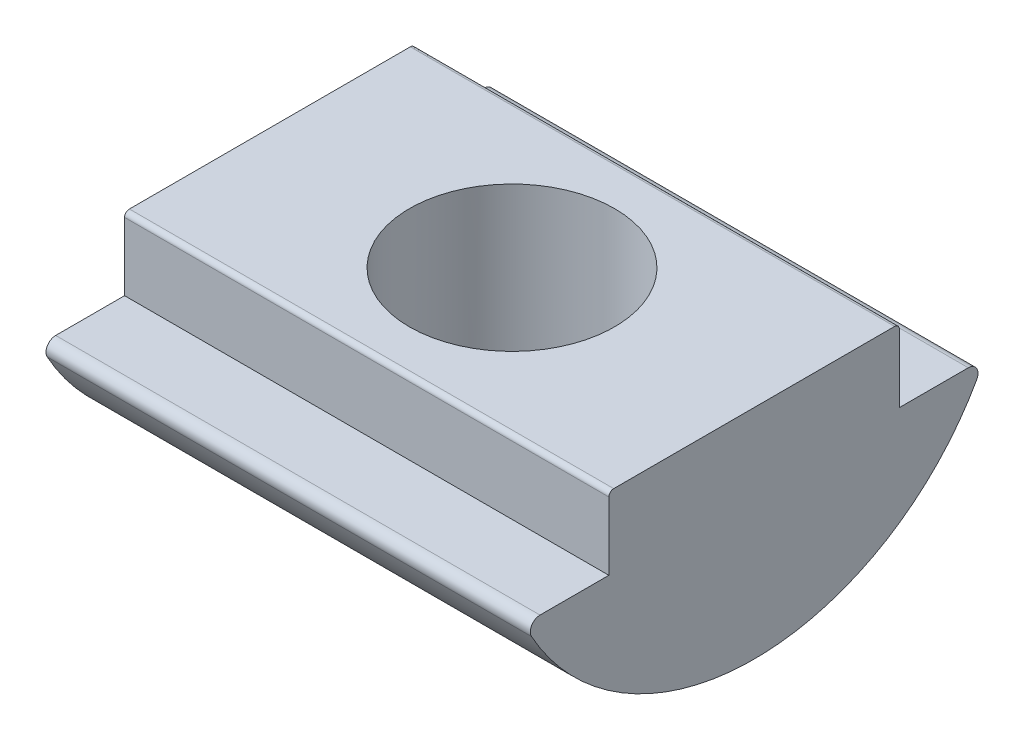
ISO-10303-21;
HEADER;
FILE_DESCRIPTION(('STEP AP214'),'2;1');
FILE_NAME('part.step','',(''),(''),'','','');
FILE_SCHEMA(('AUTOMOTIVE_DESIGN { 1 0 10303 214 1 1 1 1 }'));
ENDSEC;
DATA;
#1=APPLICATION_CONTEXT('core data for automotive mechanical design processes');
#2=APPLICATION_PROTOCOL_DEFINITION('international standard','automotive_design',2000,#1);
#3=PRODUCT_CONTEXT('',#1,'mechanical');
#4=PRODUCT('Part','Part','',(#3));
#5=PRODUCT_RELATED_PRODUCT_CATEGORY('part','',(#4));
#6=PRODUCT_DEFINITION_FORMATION('','',#4);
#7=PRODUCT_DEFINITION_CONTEXT('part definition',#1,'design');
#8=PRODUCT_DEFINITION('design','',#6,#7);
#9=PRODUCT_DEFINITION_SHAPE('','',#8);
#10=(LENGTH_UNIT() NAMED_UNIT(*) SI_UNIT(.MILLI.,.METRE.));
#11=(NAMED_UNIT(*) PLANE_ANGLE_UNIT() SI_UNIT($,.RADIAN.));
#12=(NAMED_UNIT(*) SI_UNIT($,.STERADIAN.) SOLID_ANGLE_UNIT());
#13=UNCERTAINTY_MEASURE_WITH_UNIT(LENGTH_MEASURE(1.E-05),#10,'distance_accuracy_value','');
#14=(GEOMETRIC_REPRESENTATION_CONTEXT(3) GLOBAL_UNCERTAINTY_ASSIGNED_CONTEXT((#13)) GLOBAL_UNIT_ASSIGNED_CONTEXT((#10,
#11,#12)) REPRESENTATION_CONTEXT('',''));
#15=CARTESIAN_POINT('',(0.,0.,0.));
#16=DIRECTION('',(0.,0.,1.));
#17=DIRECTION('',(1.,0.,0.));
#18=AXIS2_PLACEMENT_3D('',#15,#16,#17);
#19=CARTESIAN_POINT('',(5.,-2.25,0.));
#20=DIRECTION('',(1.,0.,0.));
#21=DIRECTION('',(0.,1.,0.));
#22=AXIS2_PLACEMENT_3D('',#19,#20,#21);
#23=PLANE('',#22);
#24=DIRECTION('',(0.,0.,1.));
#25=VECTOR('',#24,1.);
#26=CARTESIAN_POINT('',(5.,0.,0.));
#27=LINE('',#26,#25);
#28=CARTESIAN_POINT('',(5.,0.,-2.9));
#29=VERTEX_POINT('',#28);
#30=CARTESIAN_POINT('',(5.,0.,2.9));
#31=VERTEX_POINT('',#30);
#32=EDGE_CURVE('E11',#29,#31,#27,.T.);
#33=ORIENTED_EDGE('',*,*,#32,.T.);
#34=CARTESIAN_POINT('',(5.,-0.1,2.9));
#35=DIRECTION('',(1.,0.,0.));
#36=DIRECTION('',(0.,1.,0.));
#37=AXIS2_PLACEMENT_3D('',#34,#35,#36);
#38=CIRCLE('',#37,0.1);
#39=CARTESIAN_POINT('',(5.,-0.1,3.));
#40=VERTEX_POINT('',#39);
#41=EDGE_CURVE('E207',#31,#40,#38,.T.);
#42=ORIENTED_EDGE('',*,*,#41,.T.);
#43=DIRECTION('',(0.,-1.,0.));
#44=VECTOR('',#43,1.);
#45=CARTESIAN_POINT('',(5.,-0.1,3.));
#46=LINE('',#45,#44);
#47=CARTESIAN_POINT('',(5.,-1.5,3.));
#48=VERTEX_POINT('',#47);
#49=EDGE_CURVE('E178',#40,#48,#46,.T.);
#50=ORIENTED_EDGE('',*,*,#49,.T.);
#51=DIRECTION('',(0.,0.,1.));
#52=VECTOR('',#51,1.);
#53=CARTESIAN_POINT('',(5.,-1.5,3.));
#54=LINE('',#53,#52);
#55=CARTESIAN_POINT('',(5.,-1.5,4.4220093471935));
#56=VERTEX_POINT('',#55);
#57=EDGE_CURVE('E204',#48,#56,#54,.T.);
#58=ORIENTED_EDGE('',*,*,#57,.T.);
#59=CARTESIAN_POINT('',(5.,-1.7,4.4220093471935));
#60=DIRECTION('',(1.,0.,0.));
#61=DIRECTION('',(0.,1.,0.));
#62=AXIS2_PLACEMENT_3D('',#59,#60,#61);
#63=CIRCLE('',#62,0.2);
#64=CARTESIAN_POINT('',(5.,-1.7972416632359,4.59677793399078));
#65=VERTEX_POINT('',#64);
#66=EDGE_CURVE('E142',#56,#65,#63,.T.);
#67=ORIENTED_EDGE('',*,*,#66,.T.);
#68=CARTESIAN_POINT('',(5.,0.760416666666591,0.));
#69=DIRECTION('',(1.,0.,0.));
#70=DIRECTION('',(0.,-0.486208316179486,0.873842933986371));
#71=AXIS2_PLACEMENT_3D('',#68,#69,#70);
#72=CIRCLE('',#71,5.26041666666664);
#73=CARTESIAN_POINT('',(5.,-1.7972416632359,-4.59677793399078));
#74=VERTEX_POINT('',#73);
#75=EDGE_CURVE('E137',#65,#74,#72,.T.);
#76=ORIENTED_EDGE('',*,*,#75,.T.);
#77=CARTESIAN_POINT('',(5.,-1.7,-4.4220093471935));
#78=DIRECTION('',(1.,0.,0.));
#79=DIRECTION('',(0.,-0.486208316179487,-0.873842933986371));
#80=AXIS2_PLACEMENT_3D('',#77,#78,#79);
#81=CIRCLE('',#80,0.2);
#82=CARTESIAN_POINT('',(5.,-1.5,-4.4220093471935));
#83=VERTEX_POINT('',#82);
#84=EDGE_CURVE('E140',#74,#83,#81,.T.);
#85=ORIENTED_EDGE('',*,*,#84,.T.);
#86=DIRECTION('',(0.,0.,1.));
#87=VECTOR('',#86,1.);
#88=CARTESIAN_POINT('',(5.,-1.5,-3.));
#89=LINE('',#88,#87);
#90=CARTESIAN_POINT('',(5.,-1.5,-3.));
#91=VERTEX_POINT('',#90);
#92=EDGE_CURVE('E75',#83,#91,#89,.T.);
#93=ORIENTED_EDGE('',*,*,#92,.T.);
#94=DIRECTION('',(0.,1.,0.));
#95=VECTOR('',#94,1.);
#96=CARTESIAN_POINT('',(5.,-0.1,-3.));
#97=LINE('',#96,#95);
#98=CARTESIAN_POINT('',(5.,-0.1,-3.));
#99=VERTEX_POINT('',#98);
#100=EDGE_CURVE('E83',#91,#99,#97,.T.);
#101=ORIENTED_EDGE('',*,*,#100,.T.);
#102=CARTESIAN_POINT('',(5.,-0.1,-2.9));
#103=DIRECTION('',(1.,0.,0.));
#104=DIRECTION('',(0.,0.,-1.));
#105=AXIS2_PLACEMENT_3D('',#102,#103,#104);
#106=CIRCLE('',#105,0.1);
#107=EDGE_CURVE('E189',#99,#29,#106,.T.);
#108=ORIENTED_EDGE('',*,*,#107,.T.);
#109=EDGE_LOOP('',(#33,#42,#50,#58,#67,#76,#85,#93,#101,#108));
#110=FACE_BOUND('',#109,.T.);
#111=ADVANCED_FACE('F17',(#110),#23,.T.);
#112=CARTESIAN_POINT('',(0.,0.,-2.9));
#113=DIRECTION('',(0.,1.,0.));
#114=DIRECTION('',(1.,0.,0.));
#115=AXIS2_PLACEMENT_3D('',#112,#113,#114);
#116=PLANE('',#115);
#117=CARTESIAN_POINT('',(0.,0.,0.));
#118=DIRECTION('',(0.,-1.,0.));
#119=DIRECTION('',(0.,0.,1.));
#120=AXIS2_PLACEMENT_3D('',#117,#118,#119);
#121=CIRCLE('',#120,2.117);
#122=CARTESIAN_POINT('',(0.,0.,2.117));
#123=VERTEX_POINT('',#122);
#124=CARTESIAN_POINT('',(0.,0.,-2.117));
#125=VERTEX_POINT('',#124);
#126=EDGE_CURVE('E198',#123,#125,#121,.T.);
#127=ORIENTED_EDGE('',*,*,#126,.T.);
#128=CARTESIAN_POINT('',(0.,0.,0.));
#129=DIRECTION('',(0.,-1.,0.));
#130=DIRECTION('',(0.,0.,1.));
#131=AXIS2_PLACEMENT_3D('',#128,#129,#130);
#132=CIRCLE('',#131,2.117);
#133=EDGE_CURVE('E193',#125,#123,#132,.T.);
#134=ORIENTED_EDGE('',*,*,#133,.T.);
#135=EDGE_LOOP('',(#127,#134));
#136=FACE_BOUND('',#135,.T.);
#137=DIRECTION('',(1.,0.,0.));
#138=VECTOR('',#137,1.);
#139=CARTESIAN_POINT('',(0.,0.,2.9));
#140=LINE('',#139,#138);
#141=CARTESIAN_POINT('',(-5.,0.,2.9));
#142=VERTEX_POINT('',#141);
#143=EDGE_CURVE('E29',#142,#31,#140,.T.);
#144=ORIENTED_EDGE('',*,*,#143,.T.);
#145=ORIENTED_EDGE('',*,*,#32,.F.);
#146=DIRECTION('',(1.,0.,0.));
#147=VECTOR('',#146,1.);
#148=CARTESIAN_POINT('',(0.,0.,-2.9));
#149=LINE('',#148,#147);
#150=CARTESIAN_POINT('',(-5.,0.,-2.9));
#151=VERTEX_POINT('',#150);
#152=EDGE_CURVE('E174',#151,#29,#149,.T.);
#153=ORIENTED_EDGE('',*,*,#152,.F.);
#154=DIRECTION('',(0.,0.,-1.));
#155=VECTOR('',#154,1.);
#156=CARTESIAN_POINT('',(-5.,0.,0.));
#157=LINE('',#156,#155);
#158=EDGE_CURVE('E213',#142,#151,#157,.T.);
#159=ORIENTED_EDGE('',*,*,#158,.F.);
#160=EDGE_LOOP('',(#144,#145,#153,#159));
#161=FACE_BOUND('',#160,.T.);
#162=ADVANCED_FACE('F280',(#136,#161),#116,.T.);
#163=CARTESIAN_POINT('',(0.,-0.1,2.9));
#164=DIRECTION('',(1.,0.,0.));
#165=DIRECTION('',(0.,1.,0.));
#166=AXIS2_PLACEMENT_3D('',#163,#164,#165);
#167=CYLINDRICAL_SURFACE('',#166,0.1);
#168=DIRECTION('',(1.,0.,0.));
#169=VECTOR('',#168,1.);
#170=CARTESIAN_POINT('',(0.,-0.1,3.));
#171=LINE('',#170,#169);
#172=CARTESIAN_POINT('',(-5.,-0.1,3.));
#173=VERTEX_POINT('',#172);
#174=EDGE_CURVE('E181',#173,#40,#171,.T.);
#175=ORIENTED_EDGE('',*,*,#174,.T.);
#176=ORIENTED_EDGE('',*,*,#41,.F.);
#177=ORIENTED_EDGE('',*,*,#143,.F.);
#178=CARTESIAN_POINT('',(-5.,-0.1,2.9));
#179=DIRECTION('',(-1.,0.,0.));
#180=DIRECTION('',(0.,1.,0.));
#181=AXIS2_PLACEMENT_3D('',#178,#179,#180);
#182=CIRCLE('',#181,0.1);
#183=EDGE_CURVE('E170',#173,#142,#182,.T.);
#184=ORIENTED_EDGE('',*,*,#183,.F.);
#185=EDGE_LOOP('',(#175,#176,#177,#184));
#186=FACE_BOUND('',#185,.T.);
#187=ADVANCED_FACE('F276',(#186),#167,.T.);
#188=CARTESIAN_POINT('',(0.,-0.1,3.));
#189=DIRECTION('',(0.,0.,1.));
#190=DIRECTION('',(1.,0.,0.));
#191=AXIS2_PLACEMENT_3D('',#188,#189,#190);
#192=PLANE('',#191);
#193=DIRECTION('',(1.,0.,0.));
#194=VECTOR('',#193,1.);
#195=CARTESIAN_POINT('',(0.,-1.5,3.));
#196=LINE('',#195,#194);
#197=CARTESIAN_POINT('',(-5.,-1.5,3.));
#198=VERTEX_POINT('',#197);
#199=EDGE_CURVE('E182',#198,#48,#196,.T.);
#200=ORIENTED_EDGE('',*,*,#199,.T.);
#201=ORIENTED_EDGE('',*,*,#49,.F.);
#202=ORIENTED_EDGE('',*,*,#174,.F.);
#203=DIRECTION('',(0.,1.,0.));
#204=VECTOR('',#203,1.);
#205=CARTESIAN_POINT('',(-5.,-0.1,3.));
#206=LINE('',#205,#204);
#207=EDGE_CURVE('E175',#198,#173,#206,.T.);
#208=ORIENTED_EDGE('',*,*,#207,.F.);
#209=EDGE_LOOP('',(#200,#201,#202,#208));
#210=FACE_BOUND('',#209,.T.);
#211=ADVANCED_FACE('F279',(#210),#192,.T.);
#212=CARTESIAN_POINT('',(0.,-1.5,3.));
#213=DIRECTION('',(0.,1.,0.));
#214=DIRECTION('',(1.,0.,0.));
#215=AXIS2_PLACEMENT_3D('',#212,#213,#214);
#216=PLANE('',#215);
#217=DIRECTION('',(1.,0.,0.));
#218=VECTOR('',#217,1.);
#219=CARTESIAN_POINT('',(0.,-1.5,4.4220093471935));
#220=LINE('',#219,#218);
#221=CARTESIAN_POINT('',(-5.,-1.5,4.4220093471935));
#222=VERTEX_POINT('',#221);
#223=EDGE_CURVE('E169',#222,#56,#220,.T.);
#224=ORIENTED_EDGE('',*,*,#223,.T.);
#225=ORIENTED_EDGE('',*,*,#57,.F.);
#226=ORIENTED_EDGE('',*,*,#199,.F.);
#227=DIRECTION('',(0.,0.,-1.));
#228=VECTOR('',#227,1.);
#229=CARTESIAN_POINT('',(-5.,-1.5,3.));
#230=LINE('',#229,#228);
#231=EDGE_CURVE('E222',#222,#198,#230,.T.);
#232=ORIENTED_EDGE('',*,*,#231,.F.);
#233=EDGE_LOOP('',(#224,#225,#226,#232));
#234=FACE_BOUND('',#233,.T.);
#235=ADVANCED_FACE('F294',(#234),#216,.T.);
#236=CARTESIAN_POINT('',(0.,-1.7,4.4220093471935));
#237=DIRECTION('',(1.,0.,0.));
#238=DIRECTION('',(0.,1.,0.));
#239=AXIS2_PLACEMENT_3D('',#236,#237,#238);
#240=CYLINDRICAL_SURFACE('',#239,0.2);
#241=DIRECTION('',(1.,0.,0.));
#242=VECTOR('',#241,1.);
#243=CARTESIAN_POINT('',(0.,-1.7972416632359,4.59677793399078));
#244=LINE('',#243,#242);
#245=CARTESIAN_POINT('',(-5.,-1.7972416632359,4.59677793399078));
#246=VERTEX_POINT('',#245);
#247=EDGE_CURVE('E147',#246,#65,#244,.T.);
#248=ORIENTED_EDGE('',*,*,#247,.T.);
#249=ORIENTED_EDGE('',*,*,#66,.F.);
#250=ORIENTED_EDGE('',*,*,#223,.F.);
#251=CARTESIAN_POINT('',(-5.,-1.7,4.4220093471935));
#252=DIRECTION('',(-1.,0.,0.));
#253=DIRECTION('',(0.,1.,0.));
#254=AXIS2_PLACEMENT_3D('',#251,#252,#253);
#255=CIRCLE('',#254,0.2);
#256=EDGE_CURVE('E235',#246,#222,#255,.T.);
#257=ORIENTED_EDGE('',*,*,#256,.F.);
#258=EDGE_LOOP('',(#248,#249,#250,#257));
#259=FACE_BOUND('',#258,.T.);
#260=ADVANCED_FACE('F274',(#259),#240,.T.);
#261=CARTESIAN_POINT('',(0.,0.760416666666591,0.));
#262=DIRECTION('',(1.,0.,0.));
#263=DIRECTION('',(0.,-0.486208316179486,0.873842933986371));
#264=AXIS2_PLACEMENT_3D('',#261,#262,#263);
#265=CYLINDRICAL_SURFACE('',#264,5.26041666666664);
#266=CARTESIAN_POINT('',(0.,-4.05521356279914,-2.117));
#267=CARTESIAN_POINT('',(-0.0340343699446975,-4.05521503554478,-2.11699417105374));
#268=CARTESIAN_POINT('',(-0.0680661493535745,-4.05559493943595,-2.11613240673934));
#269=CARTESIAN_POINT('',(-0.136251357460678,-4.05709110713546,-2.11272540846669));
#270=CARTESIAN_POINT('',(-0.170404139391232,-4.05821214042359,-2.11016927021432));
#271=CARTESIAN_POINT('',(-0.238830745916795,-4.06118319527892,-2.10337142888061));
#272=CARTESIAN_POINT('',(-0.273102731949519,-4.06303991376115,-2.09911423808997));
#273=CARTESIAN_POINT('',(-0.341769070930095,-4.06746623480122,-2.08891396612756));
#274=CARTESIAN_POINT('',(-0.376159961841877,-4.07004412008693,-2.08295127800243));
#275=CARTESIAN_POINT('',(-0.44523398750845,-4.07590720402725,-2.06930213932706));
#276=CARTESIAN_POINT('',(-0.47990988819159,-4.07920513114918,-2.06158454891408));
#277=CARTESIAN_POINT('',(-0.548574640212661,-4.08643923966812,-2.04451867906343));
#278=CARTESIAN_POINT('',(-0.582566317678292,-4.09037158980233,-2.03518016414469));
#279=CARTESIAN_POINT('',(-0.649863205429612,-4.09884437207636,-2.01486634344044));
#280=CARTESIAN_POINT('',(-0.683170223051873,-4.10338287345614,-2.00389622266037));
#281=CARTESIAN_POINT('',(-0.749097987336444,-4.11303427718519,-1.98030847090098));
#282=CARTESIAN_POINT('',(-0.781718962766761,-4.11814698433462,-1.9676913995632));
#283=CARTESIAN_POINT('',(-0.845911861004093,-4.1288423855273,-1.94096229273271));
#284=CARTESIAN_POINT('',(-0.877490569837734,-4.13442045152168,-1.92686468498714));
#285=CARTESIAN_POINT('',(-0.940100475933886,-4.1460638135159,-1.89702173870008));
#286=CARTESIAN_POINT('',(-0.971124877226846,-4.15213279721164,-1.88126359498619));
#287=CARTESIAN_POINT('',(-1.03262772326348,-4.16471121704358,-1.84808466815149));
#288=CARTESIAN_POINT('',(-1.063096603711,-4.17122471469327,-1.83064771305409));
#289=CARTESIAN_POINT('',(-1.12349101201326,-4.18463967056115,-1.79409727968334));
#290=CARTESIAN_POINT('',(-1.15340411760189,-4.19154510548743,-1.77496476274342));
#291=CARTESIAN_POINT('',(-1.2111600744579,-4.2053212253162,-1.73604192482757));
#292=CARTESIAN_POINT('',(-1.23903860616296,-4.21218385412131,-1.71630164810154));
#293=CARTESIAN_POINT('',(-1.29363088630792,-4.22602343931657,-1.67566589928884));
#294=CARTESIAN_POINT('',(-1.32035082641295,-4.23299941289792,-1.65477841960859));
#295=CARTESIAN_POINT('',(-1.37262651092354,-4.24702395003211,-1.61184053242256));
#296=CARTESIAN_POINT('',(-1.39818662712273,-4.25407209211455,-1.58979531160397));
#297=CARTESIAN_POINT('',(-1.44814550688424,-4.26819679538087,-1.54453584705466));
#298=CARTESIAN_POINT('',(-1.47254648286257,-4.27527327196373,-1.52132401999946));
#299=CARTESIAN_POINT('',(-1.52007856031207,-4.28937716293457,-1.47383060057331));
#300=CARTESIAN_POINT('',(-1.54321471113664,-4.29640465698957,-1.44955408543545));
#301=CARTESIAN_POINT('',(-1.5883996236362,-4.31041083386255,-1.39977273622326));
#302=CARTESIAN_POINT('',(-1.61044260301433,-4.31738911782699,-1.37426254294275));
#303=CARTESIAN_POINT('',(-1.65344436156696,-4.33124449932843,-1.32200821592416));
#304=CARTESIAN_POINT('',(-1.67439457010825,-4.33812056072372,-1.29525675704466));
#305=CARTESIAN_POINT('',(-1.71521428221451,-4.35171666319676,-1.24051548428997));
#306=CARTESIAN_POINT('',(-1.73507243141759,-4.35843475635745,-1.2125167279679));
#307=CARTESIAN_POINT('',(-1.77408614997818,-4.37178869772126,-1.15471152341527));
#308=CARTESIAN_POINT('',(-1.79320165663903,-4.37841574655258,-1.12487597823876));
#309=CARTESIAN_POINT('',(-1.82977365811024,-4.39124683999114,-1.06455953413591));
#310=CARTESIAN_POINT('',(-1.84724552497469,-4.39745460902795,-1.03408876150079));
#311=CARTESIAN_POINT('',(-1.88053327847736,-4.40941745921277,-0.972509164576858));
#312=CARTESIAN_POINT('',(-1.89636185742594,-4.41517590872659,-0.941407862513951));
#313=CARTESIAN_POINT('',(-1.92636699045213,-4.42621040920348,-0.87857509511434));
#314=CARTESIAN_POINT('',(-1.94055311445353,-4.43148921156074,-0.846848687621283));
#315=CARTESIAN_POINT('',(-1.96737242616263,-4.4415727835144,-0.78252970415389));
#316=CARTESIAN_POINT('',(-1.97999961218141,-4.44637570785227,-0.749934334276129));
#317=CARTESIAN_POINT('',(-2.00363149118565,-4.4554460958251,-0.684009153934635));
#318=CARTESIAN_POINT('',(-2.01463272586211,-4.45971241534119,-0.650677946536393));
#319=CARTESIAN_POINT('',(-2.03501829780435,-4.4676720753344,-0.583290591663757));
#320=CARTESIAN_POINT('',(-2.0443950851575,-4.47136273280597,-0.549231844292767));
#321=CARTESIAN_POINT('',(-2.06153521374632,-4.47813314100162,-0.480399340879679));
#322=CARTESIAN_POINT('',(-2.06928697110425,-4.48120849898326,-0.445622272158392));
#323=CARTESIAN_POINT('',(-2.08296167011736,-4.48662280061713,-0.376478006516682));
#324=CARTESIAN_POINT('',(-2.08892210708077,-4.48897686631159,-0.342119406475736));
#325=CARTESIAN_POINT('',(-2.09912437920462,-4.49299807642356,-0.273471752429921));
#326=CARTESIAN_POINT('',(-2.10338336822664,-4.49467208023512,-0.239185661145842));
#327=CARTESIAN_POINT('',(-2.11018556860423,-4.49734049552133,-0.17069846612328));
#328=CARTESIAN_POINT('',(-2.112742434651,-4.49834031625463,-0.136498933890428));
#329=CARTESIAN_POINT('',(-2.11614453434899,-4.49966814639513,-0.0681992303094672));
#330=CARTESIAN_POINT('',(-2.11699956212584,-4.5000000000962,-0.0340996248006469));
#331=CARTESIAN_POINT('',(-2.11700043772085,-4.49999999990393,0.0340876858724113));
#332=CARTESIAN_POINT('',(-2.11614688385066,-4.49966837834658,0.0681753910231425));
#333=CARTESIAN_POINT('',(-2.11274674974559,-4.49834132042806,0.136459250351548));
#334=CARTESIAN_POINT('',(-2.11018997373487,-4.49734188631749,0.170654815800628));
#335=CARTESIAN_POINT('',(-2.10338758298932,-4.4946740927938,0.239142017341336));
#336=CARTESIAN_POINT('',(-2.09912792592625,-4.49300017047044,0.273432036963688));
#337=CARTESIAN_POINT('',(-2.08892445612971,-4.48897849424441,0.34209562128611));
#338=CARTESIAN_POINT('',(-2.08296312650885,-4.48662372835534,0.376466160536926));
#339=CARTESIAN_POINT('',(-2.06929021101961,-4.48120942277726,0.445610472787432));
#340=CARTESIAN_POINT('',(-2.06154224707883,-4.47813521162424,0.480375906706135));
#341=CARTESIAN_POINT('',(-2.04440717402733,-4.47136679043032,0.549192956540419));
#342=CARTESIAN_POINT('',(-2.035031272458,-4.46767682589953,0.583247776806273));
#343=CARTESIAN_POINT('',(-2.01464551372325,-4.45971777578128,0.650635145850448));
#344=CARTESIAN_POINT('',(-2.00364282081843,-4.45545123613375,0.683970161914635));
#345=CARTESIAN_POINT('',(-1.98000664148385,-4.44637913422032,0.74991105747847));
#346=CARTESIAN_POINT('',(-1.9673762300028,-4.44157459049456,0.782518179152099));
#347=CARTESIAN_POINT('',(-1.9405586510626,-4.43149091808353,0.846837801428357));
#348=CARTESIAN_POINT('',(-1.92637860660988,-4.42621397949927,0.878553617555393));
#349=CARTESIAN_POINT('',(-1.89638157315246,-4.41518234931417,0.941372342246801));
#350=CARTESIAN_POINT('',(-1.88055464584784,-4.40942480421237,0.972469999216728));
#351=CARTESIAN_POINT('',(-1.8472667221686,-4.39746248050201,1.03404960899447));
#352=CARTESIAN_POINT('',(-1.82979268596415,-4.3912542412926,1.06452383318942));
#353=CARTESIAN_POINT('',(-1.79321326801739,-4.37842046355107,1.12485472259854));
#354=CARTESIAN_POINT('',(-1.77409219492192,-4.3717911172647,1.15470105035208));
#355=CARTESIAN_POINT('',(-1.73507971584292,-4.35843690993389,1.21250740538008));
#356=CARTESIAN_POINT('',(-1.71522928362583,-4.35172104938388,1.24049718902495));
#357=CARTESIAN_POINT('',(-1.67441984803269,-4.33812821328288,1.29522657531874));
#358=CARTESIAN_POINT('',(-1.65347191574641,-4.33125313324207,1.32197489602152));
#359=CARTESIAN_POINT('',(-1.61047001621241,-4.31739815468703,1.3742292130538));
#360=CARTESIAN_POINT('',(-1.58842433152542,-4.31041925739888,1.39974228864036));
#361=CARTESIAN_POINT('',(-1.54322971154846,-4.29640988404506,1.44953601267422));
#362=CARTESIAN_POINT('',(-1.5200862745131,-4.28937978909234,1.47382175739443));
#363=CARTESIAN_POINT('',(-1.47255539146605,-4.27527557695278,1.52131625804209));
#364=CARTESIAN_POINT('',(-1.44816370822437,-4.26820139277681,1.54452075366575));
#365=CARTESIAN_POINT('',(-1.39821721173271,-4.2540799444333,1.58977051312823));
#366=CARTESIAN_POINT('',(-1.37265992637335,-4.24703277545591,1.6118130769334));
#367=CARTESIAN_POINT('',(-1.32038412185836,-4.23300853868316,1.65475091655301));
#368=CARTESIAN_POINT('',(-1.29366098696715,-4.22603191592084,1.67564071598629));
#369=CARTESIAN_POINT('',(-1.23905680814572,-4.21218903138496,1.71628674266744));
#370=CARTESIAN_POINT('',(-1.21116935022259,-4.20532378585279,1.73603469023166));
#371=CARTESIAN_POINT('',(-1.15341469781835,-4.19154726802122,1.77495865285221));
#372=CARTESIAN_POINT('',(-1.12351247497194,-4.1846439028565,1.79408554235712));
#373=CARTESIAN_POINT('',(-1.06313256706977,-4.1712318314945,1.83062852589));
#374=CARTESIAN_POINT('',(-1.03266709604934,-4.16471921302533,1.84806333778425));
#375=CARTESIAN_POINT('',(-0.97116415238676,-4.152141012703,1.88124216049143));
#376=CARTESIAN_POINT('',(-0.940136037043131,-4.14607145691185,1.89700199428692));
#377=CARTESIAN_POINT('',(-0.8775120330068,-4.13442504017052,1.92685307619437));
#378=CARTESIAN_POINT('',(-0.845922744051813,-4.12884459952214,1.94095675960183));
#379=CARTESIAN_POINT('',(-0.781730558742052,-4.118148512303,1.96768758107417));
#380=CARTESIAN_POINT('',(-0.749121402981924,-4.11303713385705,1.98030141274124));
#381=CARTESIAN_POINT('',(-0.683209382493917,-4.1033875543144,2.00388485933424));
#382=CARTESIAN_POINT('',(-0.649906132756729,-4.09884968175697,2.01485353247862));
#383=CARTESIAN_POINT('',(-0.582609183416459,-4.09037702627124,2.03516721096712));
#384=CARTESIAN_POINT('',(-0.548613542402897,-4.0864443175339,2.04450664612033));
#385=CARTESIAN_POINT('',(-0.479933291826672,-4.07920813839449,2.06157750872162));
#386=CARTESIAN_POINT('',(-0.445245746988619,-4.07590864662663,2.06929879520016));
#387=CARTESIAN_POINT('',(-0.376165875173534,-4.07004418624052,2.08295111006059));
#388=CARTESIAN_POINT('',(-0.341780975379376,-4.06746615249489,2.08891410399525));
#389=CARTESIAN_POINT('',(-0.273122509493772,-4.06303975775671,2.09911464879112));
#390=CARTESIAN_POINT('',(-0.238852377446325,-4.06118318389098,2.10337163884678));
#391=CARTESIAN_POINT('',(-0.170425934284868,-4.05821198852148,2.11016943553766));
#392=CARTESIAN_POINT('',(-0.136271436155822,-4.05709075395331,2.11272554172544));
#393=CARTESIAN_POINT('',(-0.0680776237052367,-4.05559520755698,2.11613246291907));
#394=CARTESIAN_POINT('',(-0.0340389523915889,-4.0552162043563,2.11699398889818));
#395=CARTESIAN_POINT('',(0.0339667684158341,-4.05521092684375,2.1170059983545));
#396=CARTESIAN_POINT('',(0.0679338167187494,-4.05558305797788,2.11616010644302));
#397=CARTESIAN_POINT('',(0.136032220296229,-4.05706974296911,2.11277343854625));
#398=CARTESIAN_POINT('',(0.170162788178644,-4.05819006997888,2.11021948275199));
#399=CARTESIAN_POINT('',(0.238589320804282,-4.06116178933478,2.10342068701961));
#400=CARTESIAN_POINT('',(0.27288318617703,-4.06302082743637,2.09915815897023));
#401=CARTESIAN_POINT('',(0.341637622992626,-4.06745434310022,2.08894143307891));
#402=CARTESIAN_POINT('',(0.376094355900632,-4.07003799776107,2.08296551230615));
#403=CARTESIAN_POINT('',(0.445233702330854,-4.07590774307213,2.06930090310574));
#404=CARTESIAN_POINT('',(0.479909811993801,-4.07920527517864,2.06158421860339));
#405=CARTESIAN_POINT('',(0.548574715966129,-4.08643909647794,2.04451900744936));
#406=CARTESIAN_POINT('',(0.582566337946214,-4.09037155149134,2.0351802520054));
#407=CARTESIAN_POINT('',(0.649863185224369,-4.09884441026807,2.01486625585328));
#408=CARTESIAN_POINT('',(0.683170217640123,-4.10338288368511,2.00389619920172));
#409=CARTESIAN_POINT('',(0.749097992746063,-4.11303426695967,1.98030849435174));
#410=CARTESIAN_POINT('',(0.781718964210614,-4.11814698160533,1.96769140582244));
#411=CARTESIAN_POINT('',(0.845911859573547,-4.12884238823216,1.94096228652948));
#412=CARTESIAN_POINT('',(0.877490569453499,-4.13442045224963,1.92686468331766));
#413=CARTESIAN_POINT('',(0.940100476323523,-4.14606381278217,1.89702174038271));
#414=CARTESIAN_POINT('',(0.97112487733294,-4.15213279701415,1.88126359543904));
#415=CARTESIAN_POINT('',(1.03262772315925,-4.16471121724364,1.8480846676926));
#416=CARTESIAN_POINT('',(1.06309660368391,-4.17122471474726,1.83064771293019));
#417=CARTESIAN_POINT('',(1.12349101204293,-4.18463967050674,1.79409727980806));
#418=CARTESIAN_POINT('',(1.15340411760989,-4.19154510547313,1.77496476277618));
#419=CARTESIAN_POINT('',(1.21116007445083,-4.20532122533011,1.7360419247956));
#420=CARTESIAN_POINT('',(1.23903860616149,-4.2121838541252,1.71630164809251));
#421=CARTESIAN_POINT('',(1.29363088631065,-4.22602343931322,1.67566589929631));
#422=CARTESIAN_POINT('',(1.32035082641436,-4.23299941289728,1.65477841960981));
#423=CARTESIAN_POINT('',(1.3726265109239,-4.24702395003342,1.61184053241928));
#424=CARTESIAN_POINT('',(1.39818662712339,-4.25407209211511,1.58979531160243));
#425=CARTESIAN_POINT('',(1.44814550688487,-4.26819679538079,1.54453584705469));
#426=CARTESIAN_POINT('',(1.47254648286287,-4.27527327196374,1.52132401999935));
#427=CARTESIAN_POINT('',(1.52007856031056,-4.28937716293421,1.47383060057461));
#428=CARTESIAN_POINT('',(1.54321471113369,-4.29640465698874,1.44955408543836));
#429=CARTESIAN_POINT('',(1.58839962363136,-4.31041083386116,1.39977273622829));
#430=CARTESIAN_POINT('',(1.61044260300897,-4.3173891178255,1.37426254294822));
#431=CARTESIAN_POINT('',(1.65344436156156,-4.33124449932702,1.32200821592962));
#432=CARTESIAN_POINT('',(1.67439457010329,-4.33812056072247,1.29525675704961));
#433=CARTESIAN_POINT('',(1.71521428221156,-4.35171666319604,1.24051548429298));
#434=CARTESIAN_POINT('',(1.73507243141618,-4.35843475635709,1.21251672796945));
#435=CARTESIAN_POINT('',(1.77408614997641,-4.37178869772052,1.15471152341847));
#436=CARTESIAN_POINT('',(1.7932016566356,-4.37841574655114,1.12487597824523));
#437=CARTESIAN_POINT('',(1.82977365810459,-4.3912468399889,1.06455953414675));
#438=CARTESIAN_POINT('',(1.8472455249684,-4.39745460902556,1.03408876151268));
#439=CARTESIAN_POINT('',(1.88053327847102,-4.40941745921055,0.972509164588751));
#440=CARTESIAN_POINT('',(1.8963618574201,-4.41517590872464,0.941407862524738));
#441=CARTESIAN_POINT('',(1.92636699044869,-4.4262104092024,0.878575095120857));
#442=CARTESIAN_POINT('',(1.94055311445188,-4.43148921156022,0.846848687624576));
#443=CARTESIAN_POINT('',(1.96737242616194,-4.44157278351403,0.782529704156259));
#444=CARTESIAN_POINT('',(1.97999961218017,-4.44637570785157,0.749934334280928));
#445=CARTESIAN_POINT('',(2.00363149118367,-4.45544609582404,0.684009153942676));
#446=CARTESIAN_POINT('',(2.01463272585985,-4.45971241534008,0.650677946545216));
#447=CARTESIAN_POINT('',(2.03501829780205,-4.46767207533342,0.583290591672581));
#448=CARTESIAN_POINT('',(2.04439508515537,-4.47136273280514,0.549231844300784));
#449=CARTESIAN_POINT('',(2.06153521374508,-4.4781331410012,0.480399340884507));
#450=CARTESIAN_POINT('',(2.06928697110364,-4.48120849898307,0.445622272160815));
#451=CARTESIAN_POINT('',(2.08296167011745,-4.48662280061712,0.376478006516836));
#452=CARTESIAN_POINT('',(2.08892210708103,-4.48897686631157,0.342119406476051));
#453=CARTESIAN_POINT('',(2.09912437920509,-4.49299807642353,0.273471752430445));
#454=CARTESIAN_POINT('',(2.10338336822712,-4.4946720802351,0.239185661146413));
#455=CARTESIAN_POINT('',(2.11018556860471,-4.49734049552131,0.170698466123845));
#456=CARTESIAN_POINT('',(2.11274243465146,-4.49834031625462,0.13649893389094));
#457=CARTESIAN_POINT('',(2.11614453434926,-4.49966814639513,0.0681992303097684));
#458=CARTESIAN_POINT('',(2.11699956212595,-4.5000000000962,0.034099624800791));
#459=CARTESIAN_POINT('',(2.11700043772074,-4.49999999990393,-0.0340876858737954));
#460=CARTESIAN_POINT('',(2.11614688385042,-4.49966837834656,-0.0681753910258978));
#461=CARTESIAN_POINT('',(2.11274674974516,-4.49834132042795,-0.136459250356129));
#462=CARTESIAN_POINT('',(2.11018997373443,-4.49734188631733,-0.170654815805667));
#463=CARTESIAN_POINT('',(2.10338758298889,-4.49467409279356,-0.239142017346373));
#464=CARTESIAN_POINT('',(2.09912792592588,-4.4930001704702,-0.273432036968272));
#465=CARTESIAN_POINT('',(2.08892445612949,-4.48897849424422,-0.342095621288864));
#466=CARTESIAN_POINT('',(2.08296312650875,-4.48662372835523,-0.37646616053831));
#467=CARTESIAN_POINT('',(2.06929021101966,-4.48120942277735,-0.445610472786269));
#468=CARTESIAN_POINT('',(2.06154224707892,-4.47813521162445,-0.480375906703792));
#469=CARTESIAN_POINT('',(2.04440717402752,-4.47136679043072,-0.549192956536516));
#470=CARTESIAN_POINT('',(2.0350312724582,-4.46767682590001,-0.583247776801979));
#471=CARTESIAN_POINT('',(2.01464551372344,-4.45971777578182,-0.650635145846148));
#472=CARTESIAN_POINT('',(2.00364282081856,-4.45545123613427,-0.683970161910706));
#473=CARTESIAN_POINT('',(1.98000664148394,-4.44637913422066,-0.749911057476116));
#474=CARTESIAN_POINT('',(1.96737623000288,-4.44157459049474,-0.782518179150934));
#475=CARTESIAN_POINT('',(1.94055865106382,-4.43149091808384,-0.846837801426362));
#476=CARTESIAN_POINT('',(1.92637860661238,-4.42621397949993,-0.878553617551453));
#477=CARTESIAN_POINT('',(1.89638157315666,-4.41518234931535,-0.941372342240279));
#478=CARTESIAN_POINT('',(1.8805546458524,-4.40942480421372,-0.972469999209534));
#479=CARTESIAN_POINT('',(1.84726672217313,-4.39746248050346,-1.03404960898728));
#480=CARTESIAN_POINT('',(1.82979268596823,-4.39125424129396,-1.06452383318288));
#481=CARTESIAN_POINT('',(1.79321326801987,-4.37842046355193,-1.12485472259464));
#482=CARTESIAN_POINT('',(1.77409219492317,-4.37179111726515,-1.15470105035014));
#483=CARTESIAN_POINT('',(1.73507971584296,-4.35843690993389,-1.21250740538009));
#484=CARTESIAN_POINT('',(1.71522928362596,-4.35172104938386,-1.24049718902501));
#485=CARTESIAN_POINT('',(1.67441984803294,-4.33812821328285,-1.29522657531886));
#486=CARTESIAN_POINT('',(1.65347191574667,-4.33125313324204,-1.32197489602164));
#487=CARTESIAN_POINT('',(1.61047001621266,-4.31739815468699,-1.37422921305394));
#488=CARTESIAN_POINT('',(1.58842433152566,-4.31041925739883,-1.39974228864052));
#489=CARTESIAN_POINT('',(1.54322971154859,-4.29640988404506,-1.44953601267425));
#490=CARTESIAN_POINT('',(1.52008627451313,-4.2893797890924,-1.47382175739431));
#491=CARTESIAN_POINT('',(1.47255539146593,-4.2752755769527,-1.5213162580423));
#492=CARTESIAN_POINT('',(1.44816370822419,-4.26820139277653,-1.54452075366642));
#493=CARTESIAN_POINT('',(1.39821721173207,-4.2540799444335,-1.5897705131278));
#494=CARTESIAN_POINT('',(1.37265992637231,-4.24703277545678,-1.61181307693139));
#495=CARTESIAN_POINT('',(1.3203841218583,-4.23300853868216,-1.65475091655538));
#496=CARTESIAN_POINT('',(1.29366098696848,-4.2260319159173,-1.67564071599465));
#497=CARTESIAN_POINT('',(1.23905680814357,-4.21218903138844,-1.71628674265928));
#498=CARTESIAN_POINT('',(1.21116935021555,-4.20532378586594,-1.73603469020079));
#499=CARTESIAN_POINT('',(1.15341469782689,-4.19154726800786,-1.77495865288341));
#500=CARTESIAN_POINT('',(1.12351247500191,-4.18464390280522,-1.79408554247723));
#501=CARTESIAN_POINT('',(1.0631325670475,-4.17123183154683,-1.83062852576675));
#502=CARTESIAN_POINT('',(1.03266709595458,-4.16471921321692,-1.84806333733405));
#503=CARTESIAN_POINT('',(0.971164152490568,-4.15214101251586,-1.88124216093047));
#504=CARTESIAN_POINT('',(0.940136037414372,-4.14607145621362,-1.89700199592595));
#505=CARTESIAN_POINT('',(0.87751203264583,-4.13442504086496,-1.92685307456382));
#506=CARTESIAN_POINT('',(0.84592274270137,-4.12884460210092,-1.94095675354733));
#507=CARTESIAN_POINT('',(0.78173056010611,-4.11814850970309,-1.96768758717823));
#508=CARTESIAN_POINT('',(0.749121408089235,-4.11303712411925,-1.98030143560358));
#509=CARTESIAN_POINT('',(0.683209377388764,-4.10338756405791,-2.00388483645848));
#510=CARTESIAN_POINT('',(0.649906113685753,-4.09884971813892,-2.01485344706122));
#511=CARTESIAN_POINT('',(0.582609202558344,-4.09037698976748,-2.03516729667047));
#512=CARTESIAN_POINT('',(0.548613613945504,-4.08644418108247,-2.04450696648037));
#513=CARTESIAN_POINT('',(0.47993321985334,-4.07920827567723,-2.06157718640983));
#514=CARTESIAN_POINT('',(0.445245477584161,-4.07590916047985,-2.06929758877794));
#515=CARTESIAN_POINT('',(0.376100253145959,-4.07003808805525,-2.0829653164867));
#516=CARTESIAN_POINT('',(0.341649468586193,-4.06745435150632,-2.0889414645589));
#517=CARTESIAN_POINT('',(0.272903020864962,-4.06302057439888,-2.09915869188731));
#518=CARTESIAN_POINT('',(0.238611166090141,-4.06116142994053,-2.10342132300245));
#519=CARTESIAN_POINT('',(0.170184369841996,-4.05819025202548,-2.11021925057251));
#520=CARTESIAN_POINT('',(0.136051509395749,-4.05707064471216,-2.11277206179759));
#521=CARTESIAN_POINT('',(0.0679460736496186,-4.05558207275767,-2.11616167852155));
#522=CARTESIAN_POINT('',(0.0339742626261081,-4.05520744560264,-2.11701142919112));
#523=CARTESIAN_POINT('',(0.,-4.05521356279914,-2.117));
#524=B_SPLINE_CURVE_WITH_KNOTS('',3,(#266,#267,#268,#269,#270,#271,#272,#273,#274,#275,#276,
#277,#278,#279,#280,#281,#282,#283,#284,#285,#286,#287,#288,#289,#290,#291,#292,#293,#294,#295,
#296,#297,#298,#299,#300,#301,#302,#303,#304,#305,#306,#307,#308,#309,#310,#311,#312,#313,#314,
#315,#316,#317,#318,#319,#320,#321,#322,#323,#324,#325,#326,#327,#328,#329,#330,#331,#332,#333,
#334,#335,#336,#337,#338,#339,#340,#341,#342,#343,#344,#345,#346,#347,#348,#349,#350,#351,#352,
#353,#354,#355,#356,#357,#358,#359,#360,#361,#362,#363,#364,#365,#366,#367,#368,#369,#370,#371,
#372,#373,#374,#375,#376,#377,#378,#379,#380,#381,#382,#383,#384,#385,#386,#387,#388,#389,#390,
#391,#392,#393,#394,#395,#396,#397,#398,#399,#400,#401,#402,#403,#404,#405,#406,#407,#408,#409,
#410,#411,#412,#413,#414,#415,#416,#417,#418,#419,#420,#421,#422,#423,#424,#425,#426,#427,#428,
#429,#430,#431,#432,#433,#434,#435,#436,#437,#438,#439,#440,#441,#442,#443,#444,#445,#446,#447,
#448,#449,#450,#451,#452,#453,#454,#455,#456,#457,#458,#459,#460,#461,#462,#463,#464,#465,#466,
#467,#468,#469,#470,#471,#472,#473,#474,#475,#476,#477,#478,#479,#480,#481,#482,#483,#484,#485,
#486,#487,#488,#489,#490,#491,#492,#493,#494,#495,#496,#497,#498,#499,#500,#501,#502,#503,#504,
#505,#506,#507,#508,#509,#510,#511,#512,#513,#514,#515,#516,#517,#518,#519,#520,#521,#522,#523),
.UNSPECIFIED.,.F.,.F.,(4,2,2,2,2,2,2,2,2,2,2,2,2,2,2,2,2,2,2,2,2,2,2,2,2,2,2,2,2,2,2,2,2,2,2,2,
2,2,2,2,2,2,2,2,2,2,2,2,2,2,2,2,2,2,2,2,2,2,2,2,2,2,2,2,2,2,2,2,2,2,2,2,2,2,2,2,2,2,2,2,2,2,2,2,
2,2,2,2,2,2,2,2,2,2,2,2,2,2,2,2,2,2,2,2,2,2,2,2,2,2,2,2,2,2,2,2,2,2,2,2,2,2,2,2,2,2,2,2,4),(0.,
0.102086796725328,0.204837044752168,0.308544942491414,0.413496634617461,0.520480380961939,
0.626840704945577,0.732869980816687,0.838863320778716,0.943905731900499,1.04982744475759,
1.15689739994104,1.26537599574048,1.36986641134105,1.47370366265325,1.57710992704585,
1.68031016460867,1.78306273696905,1.8863108568695,1.99027437583125,2.09516864596804,
2.20327100564076,2.31023313655894,2.41629561633418,2.5217051824836,2.62750868034475,
2.73353407429805,2.84003973932799,2.94728057886935,3.05208882332803,3.15581198512718,
3.25869270128113,3.36097960413294,3.46323069439149,3.56609944416397,3.66983457210118,
3.77467863117891,3.88188275907499,3.98837615853422,4.09441381723905,4.2002540170561,
4.30562669550324,4.41167684920574,4.51865130748578,4.62679057076009,4.73164885402785,
4.83560035217185,4.93886049340158,5.04164905415587,5.14481326415622,5.24820749383548,
5.35205677914652,5.45658321788031,5.56502468813028,5.6720822403151,5.77801635415349,
5.88309586682735,5.98905241903821,6.0950693971339,6.20144201982771,6.30846256427937,
6.41339681616627,6.51709885149812,6.61985499564017,6.72195953245052,6.82384754346052,
6.92653095815187,7.03030606079058,7.13545990747814,7.24244365382245,7.34880397780603,
7.45483325367719,7.56082659363939,7.66586900476249,7.77179071762002,7.87886067280304,
7.98733926860118,8.09182968420287,8.19566693551544,8.29907319990766,8.40227343746935,
8.50502600982335,8.60827412972166,8.71223764868553,8.81713191882863,8.92523427849021,
9.03219640940467,9.13825888918363,9.24366845534421,9.3494719531979,9.4554973471487,
9.56200301218114,9.66924385173,9.77405209618829,9.8777752579873,9.9806559741414,
10.0829428769937,10.1851939672563,10.2880627170302,10.391797844966,10.4966419040397,
10.6038460319322,10.7103394313903,10.8163770900963,10.9222172899167,11.0275899683569,
11.133640122057,11.2406145803394,11.3487538436208,11.4536121268885,11.5575636250325,
11.6608237662622,11.7636123270166,11.8667765370174,11.9701707666968,12.0740200520076,
12.178546490741,12.286987960986,12.3940455131691,12.4999796270092,12.605059139688,
12.7110156918961,12.8170326699909,12.9234052926856,13.0304258371401,13.135562246321,
13.2393314872823,13.3420207976124,13.4439265478624),.UNSPECIFIED.);
#525=CARTESIAN_POINT('',(0.,-4.05521356279913,-2.117));
#526=VERTEX_POINT('',#525);
#527=EDGE_CURVE('E226',#526,#526,#524,.T.);
#528=ORIENTED_EDGE('',*,*,#527,.T.);
#529=EDGE_LOOP('',(#528));
#530=FACE_BOUND('',#529,.T.);
#531=DIRECTION('',(1.,0.,0.));
#532=VECTOR('',#531,1.);
#533=CARTESIAN_POINT('',(0.,-1.7972416632359,-4.59677793399078));
#534=LINE('',#533,#532);
#535=CARTESIAN_POINT('',(-5.,-1.7972416632359,-4.59677793399078));
#536=VERTEX_POINT('',#535);
#537=EDGE_CURVE('E148',#536,#74,#534,.T.);
#538=ORIENTED_EDGE('',*,*,#537,.T.);
#539=ORIENTED_EDGE('',*,*,#75,.F.);
#540=ORIENTED_EDGE('',*,*,#247,.F.);
#541=CARTESIAN_POINT('',(-5.,0.760416666666591,0.));
#542=DIRECTION('',(-1.,0.,0.));
#543=DIRECTION('',(0.,-0.486208316179486,0.873842933986371));
#544=AXIS2_PLACEMENT_3D('',#541,#542,#543);
#545=CIRCLE('',#544,5.26041666666664);
#546=EDGE_CURVE('E153',#536,#246,#545,.T.);
#547=ORIENTED_EDGE('',*,*,#546,.F.);
#548=EDGE_LOOP('',(#538,#539,#540,#547));
#549=FACE_BOUND('',#548,.T.);
#550=ADVANCED_FACE('F151',(#530,#549),#265,.T.);
#551=CARTESIAN_POINT('',(0.,-1.7,-4.4220093471935));
#552=DIRECTION('',(1.,0.,0.));
#553=DIRECTION('',(0.,-0.486208316179487,-0.873842933986371));
#554=AXIS2_PLACEMENT_3D('',#551,#552,#553);
#555=CYLINDRICAL_SURFACE('',#554,0.2);
#556=DIRECTION('',(1.,0.,0.));
#557=VECTOR('',#556,1.);
#558=CARTESIAN_POINT('',(0.,-1.5,-4.4220093471935));
#559=LINE('',#558,#557);
#560=CARTESIAN_POINT('',(-5.,-1.5,-4.4220093471935));
#561=VERTEX_POINT('',#560);
#562=EDGE_CURVE('E130',#561,#83,#559,.T.);
#563=ORIENTED_EDGE('',*,*,#562,.T.);
#564=ORIENTED_EDGE('',*,*,#84,.F.);
#565=ORIENTED_EDGE('',*,*,#537,.F.);
#566=CARTESIAN_POINT('',(-5.,-1.7,-4.4220093471935));
#567=DIRECTION('',(-1.,0.,0.));
#568=DIRECTION('',(0.,-0.486208316179487,-0.873842933986371));
#569=AXIS2_PLACEMENT_3D('',#566,#567,#568);
#570=CIRCLE('',#569,0.2);
#571=EDGE_CURVE('E231',#561,#536,#570,.T.);
#572=ORIENTED_EDGE('',*,*,#571,.F.);
#573=EDGE_LOOP('',(#563,#564,#565,#572));
#574=FACE_BOUND('',#573,.T.);
#575=ADVANCED_FACE('F158',(#574),#555,.T.);
#576=CARTESIAN_POINT('',(0.,-1.5,-4.4220093471935));
#577=DIRECTION('',(0.,1.,0.));
#578=DIRECTION('',(1.,0.,0.));
#579=AXIS2_PLACEMENT_3D('',#576,#577,#578);
#580=PLANE('',#579);
#581=DIRECTION('',(1.,0.,0.));
#582=VECTOR('',#581,1.);
#583=CARTESIAN_POINT('',(0.,-1.5,-3.));
#584=LINE('',#583,#582);
#585=CARTESIAN_POINT('',(-5.,-1.5,-3.));
#586=VERTEX_POINT('',#585);
#587=EDGE_CURVE('E120',#586,#91,#584,.T.);
#588=ORIENTED_EDGE('',*,*,#587,.T.);
#589=ORIENTED_EDGE('',*,*,#92,.F.);
#590=ORIENTED_EDGE('',*,*,#562,.F.);
#591=DIRECTION('',(0.,0.,-1.));
#592=VECTOR('',#591,1.);
#593=CARTESIAN_POINT('',(-5.,-1.5,-3.));
#594=LINE('',#593,#592);
#595=EDGE_CURVE('E186',#586,#561,#594,.T.);
#596=ORIENTED_EDGE('',*,*,#595,.F.);
#597=EDGE_LOOP('',(#588,#589,#590,#596));
#598=FACE_BOUND('',#597,.T.);
#599=ADVANCED_FACE('F293',(#598),#580,.T.);
#600=CARTESIAN_POINT('',(0.,-1.5,-3.));
#601=DIRECTION('',(0.,0.,-1.));
#602=DIRECTION('',(0.,-1.,0.));
#603=AXIS2_PLACEMENT_3D('',#600,#601,#602);
#604=PLANE('',#603);
#605=DIRECTION('',(1.,0.,0.));
#606=VECTOR('',#605,1.);
#607=CARTESIAN_POINT('',(0.,-0.1,-3.));
#608=LINE('',#607,#606);
#609=CARTESIAN_POINT('',(-5.,-0.1,-3.));
#610=VERTEX_POINT('',#609);
#611=EDGE_CURVE('E192',#610,#99,#608,.T.);
#612=ORIENTED_EDGE('',*,*,#611,.T.);
#613=ORIENTED_EDGE('',*,*,#100,.F.);
#614=ORIENTED_EDGE('',*,*,#587,.F.);
#615=DIRECTION('',(0.,-1.,0.));
#616=VECTOR('',#615,1.);
#617=CARTESIAN_POINT('',(-5.,-0.1,-3.));
#618=LINE('',#617,#616);
#619=EDGE_CURVE('E183',#610,#586,#618,.T.);
#620=ORIENTED_EDGE('',*,*,#619,.F.);
#621=EDGE_LOOP('',(#612,#613,#614,#620));
#622=FACE_BOUND('',#621,.T.);
#623=ADVANCED_FACE('F286',(#622),#604,.T.);
#624=CARTESIAN_POINT('',(0.,-0.1,-2.9));
#625=DIRECTION('',(1.,0.,0.));
#626=DIRECTION('',(0.,0.,-1.));
#627=AXIS2_PLACEMENT_3D('',#624,#625,#626);
#628=CYLINDRICAL_SURFACE('',#627,0.1);
#629=ORIENTED_EDGE('',*,*,#152,.T.);
#630=ORIENTED_EDGE('',*,*,#107,.F.);
#631=ORIENTED_EDGE('',*,*,#611,.F.);
#632=CARTESIAN_POINT('',(-5.,-0.1,-2.9));
#633=DIRECTION('',(-1.,0.,0.));
#634=DIRECTION('',(0.,0.,-1.));
#635=AXIS2_PLACEMENT_3D('',#632,#633,#634);
#636=CIRCLE('',#635,0.1);
#637=EDGE_CURVE('E187',#151,#610,#636,.T.);
#638=ORIENTED_EDGE('',*,*,#637,.F.);
#639=EDGE_LOOP('',(#629,#630,#631,#638));
#640=FACE_BOUND('',#639,.T.);
#641=ADVANCED_FACE('F282',(#640),#628,.T.);
#642=CARTESIAN_POINT('',(-5.,-2.25,0.));
#643=DIRECTION('',(1.,0.,0.));
#644=DIRECTION('',(0.,1.,0.));
#645=AXIS2_PLACEMENT_3D('',#642,#643,#644);
#646=PLANE('',#645);
#647=ORIENTED_EDGE('',*,*,#158,.T.);
#648=ORIENTED_EDGE('',*,*,#637,.T.);
#649=ORIENTED_EDGE('',*,*,#619,.T.);
#650=ORIENTED_EDGE('',*,*,#595,.T.);
#651=ORIENTED_EDGE('',*,*,#571,.T.);
#652=ORIENTED_EDGE('',*,*,#546,.T.);
#653=ORIENTED_EDGE('',*,*,#256,.T.);
#654=ORIENTED_EDGE('',*,*,#231,.T.);
#655=ORIENTED_EDGE('',*,*,#207,.T.);
#656=ORIENTED_EDGE('',*,*,#183,.T.);
#657=EDGE_LOOP('',(#647,#648,#649,#650,#651,#652,#653,#654,#655,#656));
#658=FACE_BOUND('',#657,.T.);
#659=ADVANCED_FACE('F285',(#658),#646,.F.);
#660=CARTESIAN_POINT('',(0.,-2.475,0.));
#661=DIRECTION('',(0.,-1.,0.));
#662=DIRECTION('',(0.,0.,1.));
#663=AXIS2_PLACEMENT_3D('',#660,#661,#662);
#664=CYLINDRICAL_SURFACE('',#663,2.117);
#665=ORIENTED_EDGE('',*,*,#126,.F.);
#666=ORIENTED_EDGE('',*,*,#133,.F.);
#667=DIRECTION('',(0.,-1.,0.));
#668=VECTOR('',#667,1.);
#669=CARTESIAN_POINT('',(0.,-2.475,-2.117));
#670=LINE('',#669,#668);
#671=EDGE_CURVE('E197',#125,#526,#670,.T.);
#672=ORIENTED_EDGE('',*,*,#671,.T.);
#673=ORIENTED_EDGE('',*,*,#527,.F.);
#674=ORIENTED_EDGE('',*,*,#671,.F.);
#675=EDGE_LOOP('',(#665,#666,#672,#673,#674));
#676=FACE_BOUND('',#675,.T.);
#677=ADVANCED_FACE('F19',(#676),#664,.F.);
#678=CLOSED_SHELL('',(#111,#162,#187,#211,#235,#260,#550,#575,#599,#623,#641,#659,#677));
#679=MANIFOLD_SOLID_BREP('B1',#678);
#680=ADVANCED_BREP_SHAPE_REPRESENTATION('',(#18,#679),#14);
#681=SHAPE_DEFINITION_REPRESENTATION(#9,#680);
ENDSEC;
END-ISO-10303-21;
